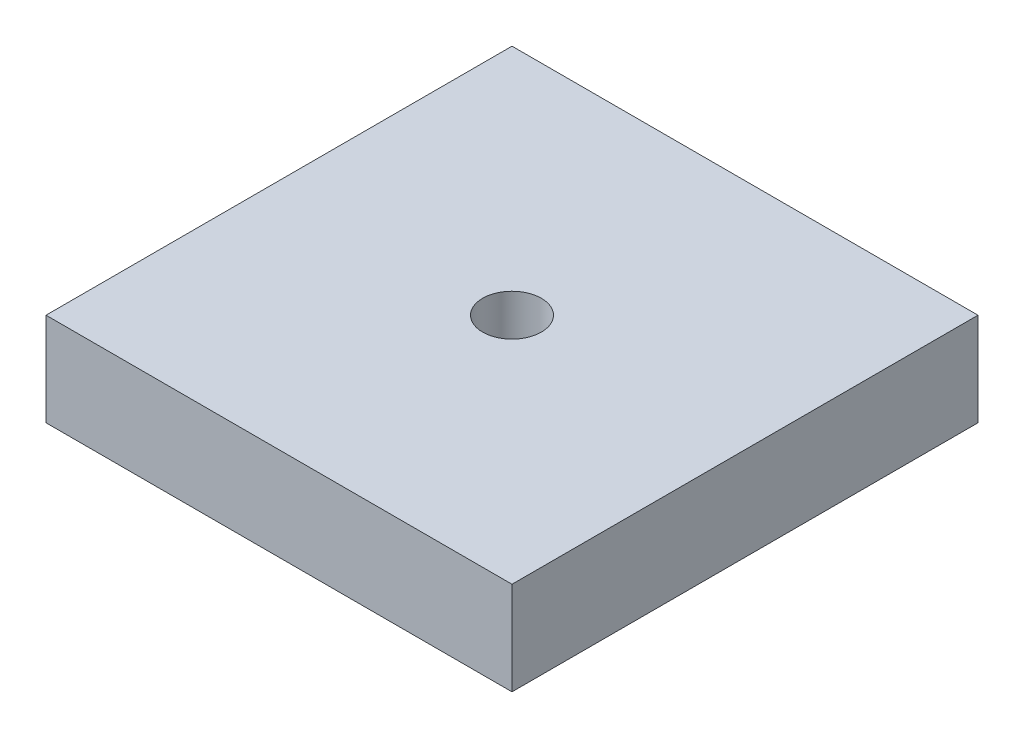
ISO-10303-21;
HEADER;
FILE_DESCRIPTION(('STEP AP214'),'2;1');
FILE_NAME('part.step','',(''),(''),'','','');
FILE_SCHEMA(('AUTOMOTIVE_DESIGN { 1 0 10303 214 1 1 1 1 }'));
ENDSEC;
DATA;
#1=APPLICATION_CONTEXT('core data for automotive mechanical design processes');
#2=APPLICATION_PROTOCOL_DEFINITION('international standard','automotive_design',2000,#1);
#3=PRODUCT_CONTEXT('',#1,'mechanical');
#4=PRODUCT('Part','Part','',(#3));
#5=PRODUCT_RELATED_PRODUCT_CATEGORY('part','',(#4));
#6=PRODUCT_DEFINITION_FORMATION('','',#4);
#7=PRODUCT_DEFINITION_CONTEXT('part definition',#1,'design');
#8=PRODUCT_DEFINITION('design','',#6,#7);
#9=PRODUCT_DEFINITION_SHAPE('','',#8);
#10=(LENGTH_UNIT() NAMED_UNIT(*) SI_UNIT(.MILLI.,.METRE.));
#11=(NAMED_UNIT(*) PLANE_ANGLE_UNIT() SI_UNIT($,.RADIAN.));
#12=(NAMED_UNIT(*) SI_UNIT($,.STERADIAN.) SOLID_ANGLE_UNIT());
#13=UNCERTAINTY_MEASURE_WITH_UNIT(LENGTH_MEASURE(1.E-05),#10,'distance_accuracy_value','');
#14=(GEOMETRIC_REPRESENTATION_CONTEXT(3) GLOBAL_UNCERTAINTY_ASSIGNED_CONTEXT((#13)) GLOBAL_UNIT_ASSIGNED_CONTEXT((#10,
#11,#12)) REPRESENTATION_CONTEXT('',''));
#15=CARTESIAN_POINT('',(0.,0.,0.));
#16=DIRECTION('',(0.,0.,1.));
#17=DIRECTION('',(1.,0.,0.));
#18=AXIS2_PLACEMENT_3D('',#15,#16,#17);
#19=CARTESIAN_POINT('',(25.,10.,-25.));
#20=DIRECTION('',(-1.,0.,0.));
#21=DIRECTION('',(0.,0.,1.));
#22=AXIS2_PLACEMENT_3D('',#19,#20,#21);
#23=PLANE('',#22);
#24=DIRECTION('',(0.,0.,-1.));
#25=VECTOR('',#24,1.);
#26=CARTESIAN_POINT('',(25.,0.,-25.));
#27=LINE('',#26,#25);
#28=CARTESIAN_POINT('',(25.,0.,25.));
#29=VERTEX_POINT('',#28);
#30=CARTESIAN_POINT('',(25.,0.,-25.));
#31=VERTEX_POINT('',#30);
#32=EDGE_CURVE('E96',#29,#31,#27,.T.);
#33=ORIENTED_EDGE('',*,*,#32,.T.);
#34=DIRECTION('',(0.,-1.,0.));
#35=VECTOR('',#34,1.);
#36=CARTESIAN_POINT('',(25.,10.,-25.));
#37=LINE('',#36,#35);
#38=CARTESIAN_POINT('',(25.,10.,-25.));
#39=VERTEX_POINT('',#38);
#40=EDGE_CURVE('E11',#39,#31,#37,.T.);
#41=ORIENTED_EDGE('',*,*,#40,.F.);
#42=DIRECTION('',(0.,0.,-1.));
#43=VECTOR('',#42,1.);
#44=CARTESIAN_POINT('',(25.,10.,-25.));
#45=LINE('',#44,#43);
#46=CARTESIAN_POINT('',(25.,10.,25.));
#47=VERTEX_POINT('',#46);
#48=EDGE_CURVE('E84',#47,#39,#45,.T.);
#49=ORIENTED_EDGE('',*,*,#48,.F.);
#50=DIRECTION('',(0.,-1.,0.));
#51=VECTOR('',#50,1.);
#52=CARTESIAN_POINT('',(25.,10.,25.));
#53=LINE('',#52,#51);
#54=EDGE_CURVE('E92',#47,#29,#53,.T.);
#55=ORIENTED_EDGE('',*,*,#54,.T.);
#56=EDGE_LOOP('',(#33,#41,#49,#55));
#57=FACE_BOUND('',#56,.T.);
#58=ADVANCED_FACE('F33',(#57),#23,.F.);
#59=CARTESIAN_POINT('',(-25.,10.,-25.));
#60=DIRECTION('',(0.,0.,1.));
#61=DIRECTION('',(1.,0.,0.));
#62=AXIS2_PLACEMENT_3D('',#59,#60,#61);
#63=PLANE('',#62);
#64=DIRECTION('',(-1.,0.,0.));
#65=VECTOR('',#64,1.);
#66=CARTESIAN_POINT('',(-25.,0.,-25.));
#67=LINE('',#66,#65);
#68=CARTESIAN_POINT('',(-25.,0.,-25.));
#69=VERTEX_POINT('',#68);
#70=EDGE_CURVE('E88',#31,#69,#67,.T.);
#71=ORIENTED_EDGE('',*,*,#70,.T.);
#72=DIRECTION('',(0.,-1.,0.));
#73=VECTOR('',#72,1.);
#74=CARTESIAN_POINT('',(-25.,10.,-25.));
#75=LINE('',#74,#73);
#76=CARTESIAN_POINT('',(-25.,10.,-25.));
#77=VERTEX_POINT('',#76);
#78=EDGE_CURVE('E41',#77,#69,#75,.T.);
#79=ORIENTED_EDGE('',*,*,#78,.F.);
#80=DIRECTION('',(-1.,0.,0.));
#81=VECTOR('',#80,1.);
#82=CARTESIAN_POINT('',(-25.,10.,-25.));
#83=LINE('',#82,#81);
#84=EDGE_CURVE('E79',#39,#77,#83,.T.);
#85=ORIENTED_EDGE('',*,*,#84,.F.);
#86=ORIENTED_EDGE('',*,*,#40,.T.);
#87=EDGE_LOOP('',(#71,#79,#85,#86));
#88=FACE_BOUND('',#87,.T.);
#89=ADVANCED_FACE('F87',(#88),#63,.F.);
#90=CARTESIAN_POINT('',(-25.,10.,-25.));
#91=DIRECTION('',(1.,0.,0.));
#92=DIRECTION('',(0.,0.,-1.));
#93=AXIS2_PLACEMENT_3D('',#90,#91,#92);
#94=PLANE('',#93);
#95=DIRECTION('',(0.,0.,1.));
#96=VECTOR('',#95,1.);
#97=CARTESIAN_POINT('',(-25.,0.,-25.));
#98=LINE('',#97,#96);
#99=CARTESIAN_POINT('',(-25.,0.,25.));
#100=VERTEX_POINT('',#99);
#101=EDGE_CURVE('E66',#69,#100,#98,.T.);
#102=ORIENTED_EDGE('',*,*,#101,.T.);
#103=DIRECTION('',(0.,-1.,0.));
#104=VECTOR('',#103,1.);
#105=CARTESIAN_POINT('',(-25.,10.,25.));
#106=LINE('',#105,#104);
#107=CARTESIAN_POINT('',(-25.,10.,25.));
#108=VERTEX_POINT('',#107);
#109=EDGE_CURVE('E89',#108,#100,#106,.T.);
#110=ORIENTED_EDGE('',*,*,#109,.F.);
#111=DIRECTION('',(0.,0.,1.));
#112=VECTOR('',#111,1.);
#113=CARTESIAN_POINT('',(-25.,10.,-25.));
#114=LINE('',#113,#112);
#115=EDGE_CURVE('E82',#77,#108,#114,.T.);
#116=ORIENTED_EDGE('',*,*,#115,.F.);
#117=ORIENTED_EDGE('',*,*,#78,.T.);
#118=EDGE_LOOP('',(#102,#110,#116,#117));
#119=FACE_BOUND('',#118,.T.);
#120=ADVANCED_FACE('F90',(#119),#94,.F.);
#121=CARTESIAN_POINT('',(-25.,10.,25.));
#122=DIRECTION('',(0.,0.,-1.));
#123=DIRECTION('',(-1.,0.,0.));
#124=AXIS2_PLACEMENT_3D('',#121,#122,#123);
#125=PLANE('',#124);
#126=DIRECTION('',(1.,0.,0.));
#127=VECTOR('',#126,1.);
#128=CARTESIAN_POINT('',(-25.,0.,25.));
#129=LINE('',#128,#127);
#130=EDGE_CURVE('E72',#100,#29,#129,.T.);
#131=ORIENTED_EDGE('',*,*,#130,.T.);
#132=ORIENTED_EDGE('',*,*,#54,.F.);
#133=DIRECTION('',(1.,0.,0.));
#134=VECTOR('',#133,1.);
#135=CARTESIAN_POINT('',(-25.,10.,25.));
#136=LINE('',#135,#134);
#137=EDGE_CURVE('E49',#108,#47,#136,.T.);
#138=ORIENTED_EDGE('',*,*,#137,.F.);
#139=ORIENTED_EDGE('',*,*,#109,.T.);
#140=EDGE_LOOP('',(#131,#132,#138,#139));
#141=FACE_BOUND('',#140,.T.);
#142=ADVANCED_FACE('F104',(#141),#125,.F.);
#143=CARTESIAN_POINT('',(0.,10.,0.));
#144=DIRECTION('',(0.,1.,0.));
#145=DIRECTION('',(0.,0.,1.));
#146=AXIS2_PLACEMENT_3D('',#143,#144,#145);
#147=PLANE('',#146);
#148=CARTESIAN_POINT('',(0.,10.,0.));
#149=DIRECTION('',(0.,1.,0.));
#150=DIRECTION('',(0.,0.,1.));
#151=AXIS2_PLACEMENT_3D('',#148,#149,#150);
#152=CIRCLE('',#151,3.15);
#153=CARTESIAN_POINT('',(0.,10.,3.15));
#154=VERTEX_POINT('',#153);
#155=EDGE_CURVE('E110',#154,#154,#152,.T.);
#156=ORIENTED_EDGE('',*,*,#155,.F.);
#157=EDGE_LOOP('',(#156));
#158=FACE_BOUND('',#157,.T.);
#159=ORIENTED_EDGE('',*,*,#48,.T.);
#160=ORIENTED_EDGE('',*,*,#84,.T.);
#161=ORIENTED_EDGE('',*,*,#115,.T.);
#162=ORIENTED_EDGE('',*,*,#137,.T.);
#163=EDGE_LOOP('',(#159,#160,#161,#162));
#164=FACE_BOUND('',#163,.T.);
#165=ADVANCED_FACE('F80',(#158,#164),#147,.T.);
#166=CARTESIAN_POINT('',(0.,0.,0.));
#167=DIRECTION('',(0.,1.,0.));
#168=DIRECTION('',(0.,0.,1.));
#169=AXIS2_PLACEMENT_3D('',#166,#167,#168);
#170=PLANE('',#169);
#171=CARTESIAN_POINT('',(0.,0.,0.));
#172=DIRECTION('',(0.,1.,0.));
#173=DIRECTION('',(0.,0.,1.));
#174=AXIS2_PLACEMENT_3D('',#171,#172,#173);
#175=CIRCLE('',#174,3.15);
#176=CARTESIAN_POINT('',(0.,0.,3.15));
#177=VERTEX_POINT('',#176);
#178=EDGE_CURVE('E99',#177,#177,#175,.T.);
#179=ORIENTED_EDGE('',*,*,#178,.T.);
#180=EDGE_LOOP('',(#179));
#181=FACE_BOUND('',#180,.T.);
#182=ORIENTED_EDGE('',*,*,#32,.F.);
#183=ORIENTED_EDGE('',*,*,#130,.F.);
#184=ORIENTED_EDGE('',*,*,#101,.F.);
#185=ORIENTED_EDGE('',*,*,#70,.F.);
#186=EDGE_LOOP('',(#182,#183,#184,#185));
#187=FACE_BOUND('',#186,.T.);
#188=ADVANCED_FACE('F107',(#181,#187),#170,.F.);
#189=CARTESIAN_POINT('',(0.,0.,0.));
#190=DIRECTION('',(0.,1.,0.));
#191=DIRECTION('',(0.,0.,1.));
#192=AXIS2_PLACEMENT_3D('',#189,#190,#191);
#193=CYLINDRICAL_SURFACE('',#192,3.15);
#194=ORIENTED_EDGE('',*,*,#178,.F.);
#195=EDGE_LOOP('',(#194));
#196=FACE_BOUND('',#195,.T.);
#197=ORIENTED_EDGE('',*,*,#155,.T.);
#198=EDGE_LOOP('',(#197));
#199=FACE_BOUND('',#198,.T.);
#200=ADVANCED_FACE('F117',(#196,#199),#193,.F.);
#201=CLOSED_SHELL('',(#58,#89,#120,#142,#165,#188,#200));
#202=MANIFOLD_SOLID_BREP('B2',#201);
#203=ADVANCED_BREP_SHAPE_REPRESENTATION('',(#18,#202),#14);
#204=SHAPE_DEFINITION_REPRESENTATION(#9,#203);
ENDSEC;
END-ISO-10303-21;
